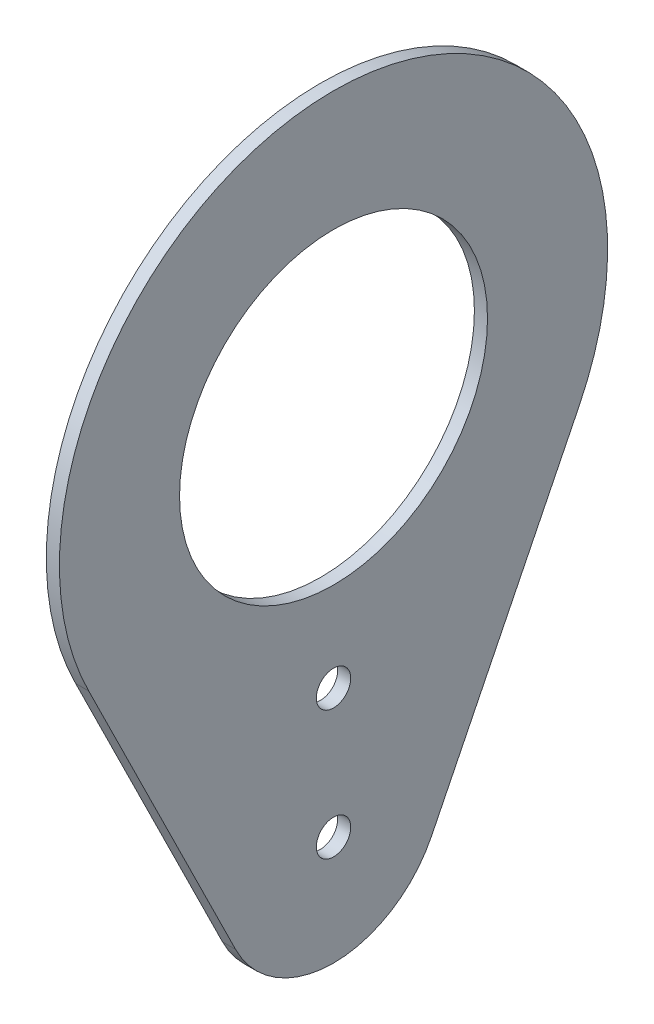
ISO-10303-21;
HEADER;
FILE_DESCRIPTION(('STEP AP214'),'2;1');
FILE_NAME('part.step','',(''),(''),'','','');
FILE_SCHEMA(('AUTOMOTIVE_DESIGN { 1 0 10303 214 1 1 1 1 }'));
ENDSEC;
DATA;
#1=APPLICATION_CONTEXT('core data for automotive mechanical design processes');
#2=APPLICATION_PROTOCOL_DEFINITION('international standard','automotive_design',2000,#1);
#3=PRODUCT_CONTEXT('',#1,'mechanical');
#4=PRODUCT('Part','Part','',(#3));
#5=PRODUCT_RELATED_PRODUCT_CATEGORY('part','',(#4));
#6=PRODUCT_DEFINITION_FORMATION('','',#4);
#7=PRODUCT_DEFINITION_CONTEXT('part definition',#1,'design');
#8=PRODUCT_DEFINITION('design','',#6,#7);
#9=PRODUCT_DEFINITION_SHAPE('','',#8);
#10=(LENGTH_UNIT() NAMED_UNIT(*) SI_UNIT(.MILLI.,.METRE.));
#11=(NAMED_UNIT(*) PLANE_ANGLE_UNIT() SI_UNIT($,.RADIAN.));
#12=(NAMED_UNIT(*) SI_UNIT($,.STERADIAN.) SOLID_ANGLE_UNIT());
#13=UNCERTAINTY_MEASURE_WITH_UNIT(LENGTH_MEASURE(1.E-05),#10,'distance_accuracy_value','');
#14=(GEOMETRIC_REPRESENTATION_CONTEXT(3) GLOBAL_UNCERTAINTY_ASSIGNED_CONTEXT((#13)) GLOBAL_UNIT_ASSIGNED_CONTEXT((#10,
#11,#12)) REPRESENTATION_CONTEXT('',''));
#15=CARTESIAN_POINT('',(0.,0.,0.));
#16=DIRECTION('',(0.,0.,1.));
#17=DIRECTION('',(1.,0.,0.));
#18=AXIS2_PLACEMENT_3D('',#15,#16,#17);
#19=CARTESIAN_POINT('',(1.524,0.,0.));
#20=DIRECTION('',(1.,0.,0.));
#21=DIRECTION('',(0.,0.,-1.));
#22=AXIS2_PLACEMENT_3D('',#19,#20,#21);
#23=PLANE('',#22);
#24=CARTESIAN_POINT('',(1.524,-28.28,0.));
#25=DIRECTION('',(1.,0.,0.));
#26=DIRECTION('',(0.,0.,-1.));
#27=AXIS2_PLACEMENT_3D('',#24,#25,#26);
#28=CIRCLE('',#27,2.);
#29=CARTESIAN_POINT('',(1.524,-28.28,2.));
#30=VERTEX_POINT('',#29);
#31=EDGE_CURVE('E114',#30,#30,#28,.T.);
#32=ORIENTED_EDGE('',*,*,#31,.F.);
#33=EDGE_LOOP('',(#32));
#34=FACE_BOUND('',#33,.T.);
#35=CARTESIAN_POINT('',(1.524,0.,0.));
#36=DIRECTION('',(1.,0.,0.));
#37=DIRECTION('',(0.,0.,-1.));
#38=AXIS2_PLACEMENT_3D('',#35,#36,#37);
#39=CIRCLE('',#38,31.8750349566612);
#40=CARTESIAN_POINT('',(1.524,-14.1213817656836,-28.5762914059223));
#41=VERTEX_POINT('',#40);
#42=CARTESIAN_POINT('',(1.524,-14.345988372093,28.4641963019535));
#43=VERTEX_POINT('',#42);
#44=EDGE_CURVE('E84',#41,#43,#39,.T.);
#45=ORIENTED_EDGE('',*,*,#44,.T.);
#46=DIRECTION('',(0.,-0.896510119746567,-0.443023255813954));
#47=VECTOR('',#46,1.);
#48=CARTESIAN_POINT('',(1.524,-14.345988372093,28.4641963019535));
#49=LINE('',#48,#47);
#50=CARTESIAN_POINT('',(1.524,-48.9063953488372,11.3856785207814));
#51=VERTEX_POINT('',#50);
#52=EDGE_CURVE('E79',#43,#51,#49,.T.);
#53=ORIENTED_EDGE('',*,*,#52,.T.);
#54=CARTESIAN_POINT('',(1.524,-43.28,0.));
#55=DIRECTION('',(1.,0.,0.));
#56=DIRECTION('',(0.,0.,-1.));
#57=AXIS2_PLACEMENT_3D('',#54,#55,#56);
#58=CIRCLE('',#57,12.7);
#59=CARTESIAN_POINT('',(1.524,-48.9066853932127,-11.385535186622));
#60=VERTEX_POINT('',#59);
#61=EDGE_CURVE('E82',#51,#60,#58,.T.);
#62=ORIENTED_EDGE('',*,*,#61,.T.);
#63=DIRECTION('',(0.,0.896498833592282,-0.443046093953752));
#64=VECTOR('',#63,1.);
#65=CARTESIAN_POINT('',(1.524,-14.1213817656836,-28.5762914059223));
#66=LINE('',#65,#64);
#67=EDGE_CURVE('E49',#60,#41,#66,.T.);
#68=ORIENTED_EDGE('',*,*,#67,.T.);
#69=EDGE_LOOP('',(#45,#53,#62,#68));
#70=FACE_BOUND('',#69,.T.);
#71=CARTESIAN_POINT('',(1.524,0.,0.));
#72=DIRECTION('',(1.,0.,0.));
#73=DIRECTION('',(0.,0.,-1.));
#74=AXIS2_PLACEMENT_3D('',#71,#72,#73);
#75=CIRCLE('',#74,17.907);
#76=CARTESIAN_POINT('',(1.524,0.,17.907));
#77=VERTEX_POINT('',#76);
#78=EDGE_CURVE('E99',#77,#77,#75,.T.);
#79=ORIENTED_EDGE('',*,*,#78,.F.);
#80=EDGE_LOOP('',(#79));
#81=FACE_BOUND('',#80,.T.);
#82=CARTESIAN_POINT('',(1.524,-43.28,0.));
#83=DIRECTION('',(1.,0.,0.));
#84=DIRECTION('',(0.,0.,-1.));
#85=AXIS2_PLACEMENT_3D('',#82,#83,#84);
#86=CIRCLE('',#85,2.);
#87=CARTESIAN_POINT('',(1.524,-43.28,2.));
#88=VERTEX_POINT('',#87);
#89=EDGE_CURVE('E120',#88,#88,#86,.T.);
#90=ORIENTED_EDGE('',*,*,#89,.F.);
#91=EDGE_LOOP('',(#90));
#92=FACE_BOUND('',#91,.T.);
#93=ADVANCED_FACE('F32',(#34,#70,#81,#92),#23,.T.);
#94=CARTESIAN_POINT('',(0.,0.,0.));
#95=DIRECTION('',(1.,0.,0.));
#96=DIRECTION('',(0.,0.,-1.));
#97=AXIS2_PLACEMENT_3D('',#94,#95,#96);
#98=PLANE('',#97);
#99=CARTESIAN_POINT('',(0.,0.,0.));
#100=DIRECTION('',(1.,0.,0.));
#101=DIRECTION('',(0.,0.,-1.));
#102=AXIS2_PLACEMENT_3D('',#99,#100,#101);
#103=CIRCLE('',#102,31.8750349566612);
#104=CARTESIAN_POINT('',(0.,-14.1213817656836,-28.5762914059223));
#105=VERTEX_POINT('',#104);
#106=CARTESIAN_POINT('',(0.,-14.345988372093,28.4641963019535));
#107=VERTEX_POINT('',#106);
#108=EDGE_CURVE('E96',#105,#107,#103,.T.);
#109=ORIENTED_EDGE('',*,*,#108,.F.);
#110=DIRECTION('',(0.,0.896498833592282,-0.443046093953752));
#111=VECTOR('',#110,1.);
#112=CARTESIAN_POINT('',(0.,-14.1213817656836,-28.5762914059223));
#113=LINE('',#112,#111);
#114=CARTESIAN_POINT('',(0.,-48.9066853932127,-11.385535186622));
#115=VERTEX_POINT('',#114);
#116=EDGE_CURVE('E72',#115,#105,#113,.T.);
#117=ORIENTED_EDGE('',*,*,#116,.F.);
#118=CARTESIAN_POINT('',(0.,-43.28,0.));
#119=DIRECTION('',(1.,0.,0.));
#120=DIRECTION('',(0.,0.,-1.));
#121=AXIS2_PLACEMENT_3D('',#118,#119,#120);
#122=CIRCLE('',#121,12.7);
#123=CARTESIAN_POINT('',(0.,-48.9063953488372,11.3856785207814));
#124=VERTEX_POINT('',#123);
#125=EDGE_CURVE('E66',#124,#115,#122,.T.);
#126=ORIENTED_EDGE('',*,*,#125,.F.);
#127=DIRECTION('',(0.,-0.896510119746567,-0.443023255813954));
#128=VECTOR('',#127,1.);
#129=CARTESIAN_POINT('',(0.,-14.345988372093,28.4641963019535));
#130=LINE('',#129,#128);
#131=EDGE_CURVE('E88',#107,#124,#130,.T.);
#132=ORIENTED_EDGE('',*,*,#131,.F.);
#133=EDGE_LOOP('',(#109,#117,#126,#132));
#134=FACE_BOUND('',#133,.T.);
#135=CARTESIAN_POINT('',(0.,0.,0.));
#136=DIRECTION('',(1.,0.,0.));
#137=DIRECTION('',(0.,0.,-1.));
#138=AXIS2_PLACEMENT_3D('',#135,#136,#137);
#139=CIRCLE('',#138,17.907);
#140=CARTESIAN_POINT('',(0.,0.,17.907));
#141=VERTEX_POINT('',#140);
#142=EDGE_CURVE('E111',#141,#141,#139,.T.);
#143=ORIENTED_EDGE('',*,*,#142,.T.);
#144=EDGE_LOOP('',(#143));
#145=FACE_BOUND('',#144,.T.);
#146=CARTESIAN_POINT('',(0.,-28.28,0.));
#147=DIRECTION('',(1.,0.,0.));
#148=DIRECTION('',(0.,0.,-1.));
#149=AXIS2_PLACEMENT_3D('',#146,#147,#148);
#150=CIRCLE('',#149,2.);
#151=CARTESIAN_POINT('',(0.,-28.28,2.));
#152=VERTEX_POINT('',#151);
#153=EDGE_CURVE('E117',#152,#152,#150,.T.);
#154=ORIENTED_EDGE('',*,*,#153,.T.);
#155=EDGE_LOOP('',(#154));
#156=FACE_BOUND('',#155,.T.);
#157=CARTESIAN_POINT('',(0.,-43.28,0.));
#158=DIRECTION('',(1.,0.,0.));
#159=DIRECTION('',(0.,0.,-1.));
#160=AXIS2_PLACEMENT_3D('',#157,#158,#159);
#161=CIRCLE('',#160,2.);
#162=CARTESIAN_POINT('',(0.,-43.28,2.));
#163=VERTEX_POINT('',#162);
#164=EDGE_CURVE('E123',#163,#163,#161,.T.);
#165=ORIENTED_EDGE('',*,*,#164,.T.);
#166=EDGE_LOOP('',(#165));
#167=FACE_BOUND('',#166,.T.);
#168=ADVANCED_FACE('F107',(#134,#145,#156,#167),#98,.F.);
#169=CARTESIAN_POINT('',(1.524,0.,0.));
#170=DIRECTION('',(-1.,0.,0.));
#171=DIRECTION('',(0.,0.,1.));
#172=AXIS2_PLACEMENT_3D('',#169,#170,#171);
#173=CYLINDRICAL_SURFACE('',#172,31.8750349566612);
#174=ORIENTED_EDGE('',*,*,#108,.T.);
#175=DIRECTION('',(-1.,0.,0.));
#176=VECTOR('',#175,1.);
#177=CARTESIAN_POINT('',(1.524,-14.345988372093,28.4641963019535));
#178=LINE('',#177,#176);
#179=EDGE_CURVE('E11',#43,#107,#178,.T.);
#180=ORIENTED_EDGE('',*,*,#179,.F.);
#181=ORIENTED_EDGE('',*,*,#44,.F.);
#182=DIRECTION('',(-1.,0.,0.));
#183=VECTOR('',#182,1.);
#184=CARTESIAN_POINT('',(1.524,-14.1213817656836,-28.5762914059223));
#185=LINE('',#184,#183);
#186=EDGE_CURVE('E92',#41,#105,#185,.T.);
#187=ORIENTED_EDGE('',*,*,#186,.T.);
#188=EDGE_LOOP('',(#174,#180,#181,#187));
#189=FACE_BOUND('',#188,.T.);
#190=ADVANCED_FACE('F34',(#189),#173,.T.);
#191=CARTESIAN_POINT('',(1.524,-14.345988372093,28.4641963019535));
#192=DIRECTION('',(0.,0.443023255813954,-0.896510119746567));
#193=DIRECTION('',(0.,0.896510119746567,0.443023255813954));
#194=AXIS2_PLACEMENT_3D('',#191,#192,#193);
#195=PLANE('',#194);
#196=ORIENTED_EDGE('',*,*,#131,.T.);
#197=DIRECTION('',(-1.,0.,0.));
#198=VECTOR('',#197,1.);
#199=CARTESIAN_POINT('',(1.524,-48.9063953488372,11.3856785207814));
#200=LINE('',#199,#198);
#201=EDGE_CURVE('E41',#51,#124,#200,.T.);
#202=ORIENTED_EDGE('',*,*,#201,.F.);
#203=ORIENTED_EDGE('',*,*,#52,.F.);
#204=ORIENTED_EDGE('',*,*,#179,.T.);
#205=EDGE_LOOP('',(#196,#202,#203,#204));
#206=FACE_BOUND('',#205,.T.);
#207=ADVANCED_FACE('F87',(#206),#195,.F.);
#208=CARTESIAN_POINT('',(1.524,-43.28,0.));
#209=DIRECTION('',(-1.,0.,0.));
#210=DIRECTION('',(0.,0.,1.));
#211=AXIS2_PLACEMENT_3D('',#208,#209,#210);
#212=CYLINDRICAL_SURFACE('',#211,12.7);
#213=ORIENTED_EDGE('',*,*,#125,.T.);
#214=DIRECTION('',(-1.,0.,0.));
#215=VECTOR('',#214,1.);
#216=CARTESIAN_POINT('',(1.524,-48.9066853932127,-11.385535186622));
#217=LINE('',#216,#215);
#218=EDGE_CURVE('E89',#60,#115,#217,.T.);
#219=ORIENTED_EDGE('',*,*,#218,.F.);
#220=ORIENTED_EDGE('',*,*,#61,.F.);
#221=ORIENTED_EDGE('',*,*,#201,.T.);
#222=EDGE_LOOP('',(#213,#219,#220,#221));
#223=FACE_BOUND('',#222,.T.);
#224=ADVANCED_FACE('F90',(#223),#212,.T.);
#225=CARTESIAN_POINT('',(1.524,-14.1213817656836,-28.5762914059223));
#226=DIRECTION('',(0.,0.443046093953752,0.896498833592282));
#227=DIRECTION('',(0.,-0.896498833592283,0.443046093953752));
#228=AXIS2_PLACEMENT_3D('',#225,#226,#227);
#229=PLANE('',#228);
#230=ORIENTED_EDGE('',*,*,#116,.T.);
#231=ORIENTED_EDGE('',*,*,#186,.F.);
#232=ORIENTED_EDGE('',*,*,#67,.F.);
#233=ORIENTED_EDGE('',*,*,#218,.T.);
#234=EDGE_LOOP('',(#230,#231,#232,#233));
#235=FACE_BOUND('',#234,.T.);
#236=ADVANCED_FACE('F104',(#235),#229,.F.);
#237=CARTESIAN_POINT('',(1.524,0.,0.));
#238=DIRECTION('',(-1.,0.,0.));
#239=DIRECTION('',(0.,0.,1.));
#240=AXIS2_PLACEMENT_3D('',#237,#238,#239);
#241=CYLINDRICAL_SURFACE('',#240,17.907);
#242=CARTESIAN_POINT('',(1.524,0.,17.907));
#243=CARTESIAN_POINT('',(1.508125,0.,17.907));
#244=CARTESIAN_POINT('',(1.49225,0.,17.907));
#245=CARTESIAN_POINT('',(1.4605,0.,17.907));
#246=CARTESIAN_POINT('',(1.444625,0.,17.907));
#247=CARTESIAN_POINT('',(1.412875,0.,17.907));
#248=CARTESIAN_POINT('',(1.397,0.,17.907));
#249=CARTESIAN_POINT('',(1.36525,0.,17.907));
#250=CARTESIAN_POINT('',(1.349375,0.,17.907));
#251=CARTESIAN_POINT('',(1.317625,0.,17.907));
#252=CARTESIAN_POINT('',(1.30175,0.,17.907));
#253=CARTESIAN_POINT('',(1.27,0.,17.907));
#254=CARTESIAN_POINT('',(1.254125,0.,17.907));
#255=CARTESIAN_POINT('',(1.222375,0.,17.907));
#256=CARTESIAN_POINT('',(1.2065,0.,17.907));
#257=CARTESIAN_POINT('',(1.17475,0.,17.907));
#258=CARTESIAN_POINT('',(1.158875,0.,17.907));
#259=CARTESIAN_POINT('',(1.127125,0.,17.907));
#260=CARTESIAN_POINT('',(1.11125,0.,17.907));
#261=CARTESIAN_POINT('',(1.0795,0.,17.907));
#262=CARTESIAN_POINT('',(1.063625,0.,17.907));
#263=CARTESIAN_POINT('',(1.031875,0.,17.907));
#264=CARTESIAN_POINT('',(1.016,0.,17.907));
#265=CARTESIAN_POINT('',(0.98425,0.,17.907));
#266=CARTESIAN_POINT('',(0.968375,0.,17.907));
#267=CARTESIAN_POINT('',(0.936625,0.,17.907));
#268=CARTESIAN_POINT('',(0.92075,0.,17.907));
#269=CARTESIAN_POINT('',(0.889,0.,17.907));
#270=CARTESIAN_POINT('',(0.873125,0.,17.907));
#271=CARTESIAN_POINT('',(0.841375,0.,17.907));
#272=CARTESIAN_POINT('',(0.8255,0.,17.907));
#273=CARTESIAN_POINT('',(0.79375,0.,17.907));
#274=CARTESIAN_POINT('',(0.777875,0.,17.907));
#275=CARTESIAN_POINT('',(0.746125,0.,17.907));
#276=CARTESIAN_POINT('',(0.73025,0.,17.907));
#277=CARTESIAN_POINT('',(0.6985,0.,17.907));
#278=CARTESIAN_POINT('',(0.682625,0.,17.907));
#279=CARTESIAN_POINT('',(0.650875,0.,17.907));
#280=CARTESIAN_POINT('',(0.635,0.,17.907));
#281=CARTESIAN_POINT('',(0.60325,0.,17.907));
#282=CARTESIAN_POINT('',(0.587375,0.,17.907));
#283=CARTESIAN_POINT('',(0.555625,0.,17.907));
#284=CARTESIAN_POINT('',(0.53975,0.,17.907));
#285=CARTESIAN_POINT('',(0.508,0.,17.907));
#286=CARTESIAN_POINT('',(0.492125,0.,17.907));
#287=CARTESIAN_POINT('',(0.460375,0.,17.907));
#288=CARTESIAN_POINT('',(0.4445,0.,17.907));
#289=CARTESIAN_POINT('',(0.41275,0.,17.907));
#290=CARTESIAN_POINT('',(0.396875,0.,17.907));
#291=CARTESIAN_POINT('',(0.365125,0.,17.907));
#292=CARTESIAN_POINT('',(0.34925,0.,17.907));
#293=CARTESIAN_POINT('',(0.3175,0.,17.907));
#294=CARTESIAN_POINT('',(0.301625,0.,17.907));
#295=CARTESIAN_POINT('',(0.269875,0.,17.907));
#296=CARTESIAN_POINT('',(0.254,0.,17.907));
#297=CARTESIAN_POINT('',(0.22225,0.,17.907));
#298=CARTESIAN_POINT('',(0.206375,0.,17.907));
#299=CARTESIAN_POINT('',(0.174625,0.,17.907));
#300=CARTESIAN_POINT('',(0.15875,0.,17.907));
#301=CARTESIAN_POINT('',(0.127,0.,17.907));
#302=CARTESIAN_POINT('',(0.111125,0.,17.907));
#303=CARTESIAN_POINT('',(0.079375,0.,17.907));
#304=CARTESIAN_POINT('',(0.0635,0.,17.907));
#305=CARTESIAN_POINT('',(0.0317499999999999,0.,17.907));
#306=CARTESIAN_POINT('',(0.015875,0.,17.907));
#307=CARTESIAN_POINT('',(0.,0.,17.907));
#308=B_SPLINE_CURVE_WITH_KNOTS('',3,(#242,#243,#244,#245,#246,#247,#248,#249,#250,#251,#252,
#253,#254,#255,#256,#257,#258,#259,#260,#261,#262,#263,#264,#265,#266,#267,#268,#269,#270,#271,
#272,#273,#274,#275,#276,#277,#278,#279,#280,#281,#282,#283,#284,#285,#286,#287,#288,#289,#290,
#291,#292,#293,#294,#295,#296,#297,#298,#299,#300,#301,#302,#303,#304,#305,#306,#307),
.UNSPECIFIED.,.F.,.F.,(4,2,2,2,2,2,2,2,2,2,2,2,2,2,2,2,2,2,2,2,2,2,2,2,2,2,2,2,2,2,2,2,4),(0.,
0.0476249999999999,0.0952499999999998,0.142875,0.1905,0.238125,0.28575,0.333375,0.381,0.428625,
0.47625,0.523875,0.5715,0.619125,0.66675,0.714375,0.762,0.809625,0.85725,0.904875,0.9525,
1.000125,1.04775,1.095375,1.143,1.190625,1.23825,1.285875,1.3335,1.381125,1.42875,1.476375,
1.524),.UNSPECIFIED.);
#309=EDGE_CURVE('BSEAM141',#77,#141,#308,.T.);
#310=ORIENTED_EDGE('',*,*,#78,.T.);
#311=ORIENTED_EDGE('',*,*,#142,.F.);
#312=ORIENTED_EDGE('',*,*,#309,.T.);
#313=ORIENTED_EDGE('',*,*,#309,.F.);
#314=EDGE_LOOP('',(#310,#312,#311,#313));
#315=FACE_BOUND('',#314,.T.);
#316=ADVANCED_FACE('F141',(#315),#241,.F.);
#317=CARTESIAN_POINT('',(1.524,-28.28,0.));
#318=DIRECTION('',(-1.,0.,0.));
#319=DIRECTION('',(0.,0.,1.));
#320=AXIS2_PLACEMENT_3D('',#317,#318,#319);
#321=CYLINDRICAL_SURFACE('',#320,2.);
#322=CARTESIAN_POINT('',(1.524,-28.28,2.));
#323=CARTESIAN_POINT('',(1.508125,-28.28,2.));
#324=CARTESIAN_POINT('',(1.49225,-28.28,2.));
#325=CARTESIAN_POINT('',(1.4605,-28.28,2.));
#326=CARTESIAN_POINT('',(1.444625,-28.28,2.));
#327=CARTESIAN_POINT('',(1.412875,-28.28,2.));
#328=CARTESIAN_POINT('',(1.397,-28.28,2.));
#329=CARTESIAN_POINT('',(1.36525,-28.28,2.));
#330=CARTESIAN_POINT('',(1.349375,-28.28,2.));
#331=CARTESIAN_POINT('',(1.317625,-28.28,2.));
#332=CARTESIAN_POINT('',(1.30175,-28.28,2.));
#333=CARTESIAN_POINT('',(1.27,-28.28,2.));
#334=CARTESIAN_POINT('',(1.254125,-28.28,2.));
#335=CARTESIAN_POINT('',(1.222375,-28.28,2.));
#336=CARTESIAN_POINT('',(1.2065,-28.28,2.));
#337=CARTESIAN_POINT('',(1.17475,-28.28,2.));
#338=CARTESIAN_POINT('',(1.158875,-28.28,2.));
#339=CARTESIAN_POINT('',(1.127125,-28.28,2.));
#340=CARTESIAN_POINT('',(1.11125,-28.28,2.));
#341=CARTESIAN_POINT('',(1.0795,-28.28,2.));
#342=CARTESIAN_POINT('',(1.063625,-28.28,2.));
#343=CARTESIAN_POINT('',(1.031875,-28.28,2.));
#344=CARTESIAN_POINT('',(1.016,-28.28,2.));
#345=CARTESIAN_POINT('',(0.98425,-28.28,2.));
#346=CARTESIAN_POINT('',(0.968375,-28.28,2.));
#347=CARTESIAN_POINT('',(0.936625,-28.28,2.));
#348=CARTESIAN_POINT('',(0.92075,-28.28,2.));
#349=CARTESIAN_POINT('',(0.889,-28.28,2.));
#350=CARTESIAN_POINT('',(0.873125,-28.28,2.));
#351=CARTESIAN_POINT('',(0.841375,-28.28,2.));
#352=CARTESIAN_POINT('',(0.8255,-28.28,2.));
#353=CARTESIAN_POINT('',(0.79375,-28.28,2.));
#354=CARTESIAN_POINT('',(0.777875,-28.28,2.));
#355=CARTESIAN_POINT('',(0.746125,-28.28,2.));
#356=CARTESIAN_POINT('',(0.73025,-28.28,2.));
#357=CARTESIAN_POINT('',(0.6985,-28.28,2.));
#358=CARTESIAN_POINT('',(0.682625,-28.28,2.));
#359=CARTESIAN_POINT('',(0.650875,-28.28,2.));
#360=CARTESIAN_POINT('',(0.635,-28.28,2.));
#361=CARTESIAN_POINT('',(0.60325,-28.28,2.));
#362=CARTESIAN_POINT('',(0.587375,-28.28,2.));
#363=CARTESIAN_POINT('',(0.555625,-28.28,2.));
#364=CARTESIAN_POINT('',(0.53975,-28.28,2.));
#365=CARTESIAN_POINT('',(0.508,-28.28,2.));
#366=CARTESIAN_POINT('',(0.492125,-28.28,2.));
#367=CARTESIAN_POINT('',(0.460375,-28.28,2.));
#368=CARTESIAN_POINT('',(0.4445,-28.28,2.));
#369=CARTESIAN_POINT('',(0.41275,-28.28,2.));
#370=CARTESIAN_POINT('',(0.396875,-28.28,2.));
#371=CARTESIAN_POINT('',(0.365125,-28.28,2.));
#372=CARTESIAN_POINT('',(0.34925,-28.28,2.));
#373=CARTESIAN_POINT('',(0.3175,-28.28,2.));
#374=CARTESIAN_POINT('',(0.301625,-28.28,2.));
#375=CARTESIAN_POINT('',(0.269875,-28.28,2.));
#376=CARTESIAN_POINT('',(0.254,-28.28,2.));
#377=CARTESIAN_POINT('',(0.22225,-28.28,2.));
#378=CARTESIAN_POINT('',(0.206375,-28.28,2.));
#379=CARTESIAN_POINT('',(0.174625,-28.28,2.));
#380=CARTESIAN_POINT('',(0.15875,-28.28,2.));
#381=CARTESIAN_POINT('',(0.127,-28.28,2.));
#382=CARTESIAN_POINT('',(0.111125,-28.28,2.));
#383=CARTESIAN_POINT('',(0.079375,-28.28,2.));
#384=CARTESIAN_POINT('',(0.0635,-28.28,2.));
#385=CARTESIAN_POINT('',(0.0317499999999999,-28.28,2.));
#386=CARTESIAN_POINT('',(0.015875,-28.28,2.));
#387=CARTESIAN_POINT('',(0.,-28.28,2.));
#388=B_SPLINE_CURVE_WITH_KNOTS('',3,(#322,#323,#324,#325,#326,#327,#328,#329,#330,#331,#332,
#333,#334,#335,#336,#337,#338,#339,#340,#341,#342,#343,#344,#345,#346,#347,#348,#349,#350,#351,
#352,#353,#354,#355,#356,#357,#358,#359,#360,#361,#362,#363,#364,#365,#366,#367,#368,#369,#370,
#371,#372,#373,#374,#375,#376,#377,#378,#379,#380,#381,#382,#383,#384,#385,#386,#387),
.UNSPECIFIED.,.F.,.F.,(4,2,2,2,2,2,2,2,2,2,2,2,2,2,2,2,2,2,2,2,2,2,2,2,2,2,2,2,2,2,2,2,4),(0.,
0.0476250000000001,0.0952500000000001,0.142875,0.1905,0.238125,0.28575,0.333375,0.381,0.428625,
0.47625,0.523875,0.5715,0.619125,0.66675,0.714375,0.762,0.809625,0.85725,0.904875,0.9525,
1.000125,1.04775,1.095375,1.143,1.190625,1.23825,1.285875,1.3335,1.381125,1.42875,1.476375,
1.524),.UNSPECIFIED.);
#389=EDGE_CURVE('BSEAM187',#30,#152,#388,.T.);
#390=ORIENTED_EDGE('',*,*,#31,.T.);
#391=ORIENTED_EDGE('',*,*,#153,.F.);
#392=ORIENTED_EDGE('',*,*,#389,.T.);
#393=ORIENTED_EDGE('',*,*,#389,.F.);
#394=EDGE_LOOP('',(#390,#392,#391,#393));
#395=FACE_BOUND('',#394,.T.);
#396=ADVANCED_FACE('F187',(#395),#321,.F.);
#397=CARTESIAN_POINT('',(1.524,-43.28,0.));
#398=DIRECTION('',(-1.,0.,0.));
#399=DIRECTION('',(0.,0.,1.));
#400=AXIS2_PLACEMENT_3D('',#397,#398,#399);
#401=CYLINDRICAL_SURFACE('',#400,2.);
#402=CARTESIAN_POINT('',(1.524,-43.28,2.));
#403=CARTESIAN_POINT('',(1.508125,-43.28,2.));
#404=CARTESIAN_POINT('',(1.49225,-43.28,2.));
#405=CARTESIAN_POINT('',(1.4605,-43.28,2.));
#406=CARTESIAN_POINT('',(1.444625,-43.28,2.));
#407=CARTESIAN_POINT('',(1.412875,-43.28,2.));
#408=CARTESIAN_POINT('',(1.397,-43.28,2.));
#409=CARTESIAN_POINT('',(1.36525,-43.28,2.));
#410=CARTESIAN_POINT('',(1.349375,-43.28,2.));
#411=CARTESIAN_POINT('',(1.317625,-43.28,2.));
#412=CARTESIAN_POINT('',(1.30175,-43.28,2.));
#413=CARTESIAN_POINT('',(1.27,-43.28,2.));
#414=CARTESIAN_POINT('',(1.254125,-43.28,2.));
#415=CARTESIAN_POINT('',(1.222375,-43.28,2.));
#416=CARTESIAN_POINT('',(1.2065,-43.28,2.));
#417=CARTESIAN_POINT('',(1.17475,-43.28,2.));
#418=CARTESIAN_POINT('',(1.158875,-43.28,2.));
#419=CARTESIAN_POINT('',(1.127125,-43.28,2.));
#420=CARTESIAN_POINT('',(1.11125,-43.28,2.));
#421=CARTESIAN_POINT('',(1.0795,-43.28,2.));
#422=CARTESIAN_POINT('',(1.063625,-43.28,2.));
#423=CARTESIAN_POINT('',(1.031875,-43.28,2.));
#424=CARTESIAN_POINT('',(1.016,-43.28,2.));
#425=CARTESIAN_POINT('',(0.98425,-43.28,2.));
#426=CARTESIAN_POINT('',(0.968375,-43.28,2.));
#427=CARTESIAN_POINT('',(0.936625,-43.28,2.));
#428=CARTESIAN_POINT('',(0.92075,-43.28,2.));
#429=CARTESIAN_POINT('',(0.889,-43.28,2.));
#430=CARTESIAN_POINT('',(0.873125,-43.28,2.));
#431=CARTESIAN_POINT('',(0.841375,-43.28,2.));
#432=CARTESIAN_POINT('',(0.8255,-43.28,2.));
#433=CARTESIAN_POINT('',(0.79375,-43.28,2.));
#434=CARTESIAN_POINT('',(0.777875,-43.28,2.));
#435=CARTESIAN_POINT('',(0.746125,-43.28,2.));
#436=CARTESIAN_POINT('',(0.73025,-43.28,2.));
#437=CARTESIAN_POINT('',(0.6985,-43.28,2.));
#438=CARTESIAN_POINT('',(0.682625,-43.28,2.));
#439=CARTESIAN_POINT('',(0.650875,-43.28,2.));
#440=CARTESIAN_POINT('',(0.635,-43.28,2.));
#441=CARTESIAN_POINT('',(0.60325,-43.28,2.));
#442=CARTESIAN_POINT('',(0.587375,-43.28,2.));
#443=CARTESIAN_POINT('',(0.555625,-43.28,2.));
#444=CARTESIAN_POINT('',(0.53975,-43.28,2.));
#445=CARTESIAN_POINT('',(0.508,-43.28,2.));
#446=CARTESIAN_POINT('',(0.492125,-43.28,2.));
#447=CARTESIAN_POINT('',(0.460375,-43.28,2.));
#448=CARTESIAN_POINT('',(0.4445,-43.28,2.));
#449=CARTESIAN_POINT('',(0.41275,-43.28,2.));
#450=CARTESIAN_POINT('',(0.396875,-43.28,2.));
#451=CARTESIAN_POINT('',(0.365125,-43.28,2.));
#452=CARTESIAN_POINT('',(0.34925,-43.28,2.));
#453=CARTESIAN_POINT('',(0.3175,-43.28,2.));
#454=CARTESIAN_POINT('',(0.301625,-43.28,2.));
#455=CARTESIAN_POINT('',(0.269875,-43.28,2.));
#456=CARTESIAN_POINT('',(0.254,-43.28,2.));
#457=CARTESIAN_POINT('',(0.22225,-43.28,2.));
#458=CARTESIAN_POINT('',(0.206375,-43.28,2.));
#459=CARTESIAN_POINT('',(0.174625,-43.28,2.));
#460=CARTESIAN_POINT('',(0.15875,-43.28,2.));
#461=CARTESIAN_POINT('',(0.127,-43.28,2.));
#462=CARTESIAN_POINT('',(0.111125,-43.28,2.));
#463=CARTESIAN_POINT('',(0.079375,-43.28,2.));
#464=CARTESIAN_POINT('',(0.0635,-43.28,2.));
#465=CARTESIAN_POINT('',(0.0317499999999999,-43.28,2.));
#466=CARTESIAN_POINT('',(0.015875,-43.28,2.));
#467=CARTESIAN_POINT('',(0.,-43.28,2.));
#468=B_SPLINE_CURVE_WITH_KNOTS('',3,(#402,#403,#404,#405,#406,#407,#408,#409,#410,#411,#412,
#413,#414,#415,#416,#417,#418,#419,#420,#421,#422,#423,#424,#425,#426,#427,#428,#429,#430,#431,
#432,#433,#434,#435,#436,#437,#438,#439,#440,#441,#442,#443,#444,#445,#446,#447,#448,#449,#450,
#451,#452,#453,#454,#455,#456,#457,#458,#459,#460,#461,#462,#463,#464,#465,#466,#467),
.UNSPECIFIED.,.F.,.F.,(4,2,2,2,2,2,2,2,2,2,2,2,2,2,2,2,2,2,2,2,2,2,2,2,2,2,2,2,2,2,2,2,4),(0.,
0.0476250000000001,0.0952500000000001,0.142875,0.1905,0.238125,0.28575,0.333375,0.381,0.428625,
0.47625,0.523875,0.5715,0.619125,0.66675,0.714375,0.762,0.809625,0.85725,0.904875,0.9525,
1.000125,1.04775,1.095375,1.143,1.190625,1.23825,1.285875,1.3335,1.381125,1.42875,1.476375,
1.524),.UNSPECIFIED.);
#469=EDGE_CURVE('BSEAM129',#88,#163,#468,.T.);
#470=ORIENTED_EDGE('',*,*,#89,.T.);
#471=ORIENTED_EDGE('',*,*,#164,.F.);
#472=ORIENTED_EDGE('',*,*,#469,.T.);
#473=ORIENTED_EDGE('',*,*,#469,.F.);
#474=EDGE_LOOP('',(#470,#472,#471,#473));
#475=FACE_BOUND('',#474,.T.);
#476=ADVANCED_FACE('F129',(#475),#401,.F.);
#477=CLOSED_SHELL('',(#93,#168,#190,#207,#224,#236,#316,#396,#476));
#478=MANIFOLD_SOLID_BREP('B2',#477);
#479=ADVANCED_BREP_SHAPE_REPRESENTATION('',(#18,#478),#14);
#480=SHAPE_DEFINITION_REPRESENTATION(#9,#479);
ENDSEC;
END-ISO-10303-21;
